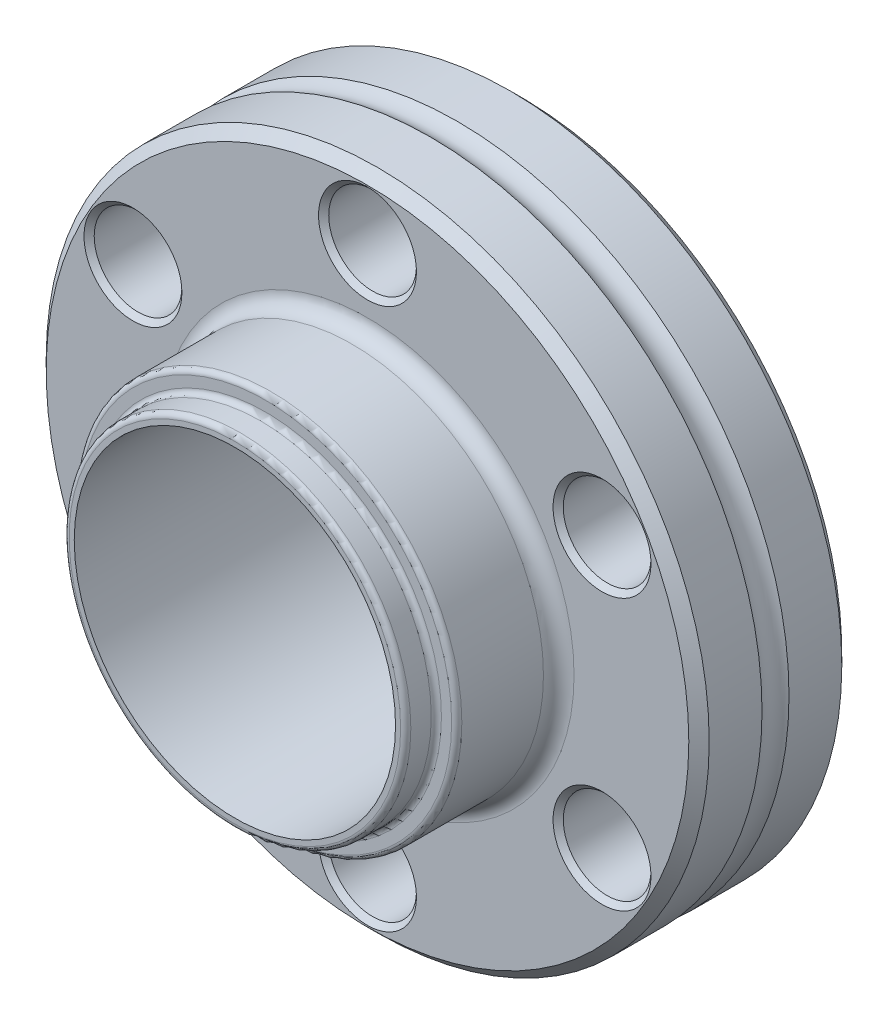
ISO-10303-21;
HEADER;
FILE_DESCRIPTION(('STEP AP214'),'2;1');
FILE_NAME('part.step','',(''),(''),'','','');
FILE_SCHEMA(('AUTOMOTIVE_DESIGN { 1 0 10303 214 1 1 1 1 }'));
ENDSEC;
DATA;
#1=APPLICATION_CONTEXT('core data for automotive mechanical design processes');
#2=APPLICATION_PROTOCOL_DEFINITION('international standard','automotive_design',2000,#1);
#3=PRODUCT_CONTEXT('',#1,'mechanical');
#4=PRODUCT('Part','Part','',(#3));
#5=PRODUCT_RELATED_PRODUCT_CATEGORY('part','',(#4));
#6=PRODUCT_DEFINITION_FORMATION('','',#4);
#7=PRODUCT_DEFINITION_CONTEXT('part definition',#1,'design');
#8=PRODUCT_DEFINITION('design','',#6,#7);
#9=PRODUCT_DEFINITION_SHAPE('','',#8);
#10=(LENGTH_UNIT() NAMED_UNIT(*) SI_UNIT(.MILLI.,.METRE.));
#11=(NAMED_UNIT(*) PLANE_ANGLE_UNIT() SI_UNIT($,.RADIAN.));
#12=(NAMED_UNIT(*) SI_UNIT($,.STERADIAN.) SOLID_ANGLE_UNIT());
#13=UNCERTAINTY_MEASURE_WITH_UNIT(LENGTH_MEASURE(1.E-05),#10,'distance_accuracy_value','');
#14=(GEOMETRIC_REPRESENTATION_CONTEXT(3) GLOBAL_UNCERTAINTY_ASSIGNED_CONTEXT((#13)) GLOBAL_UNIT_ASSIGNED_CONTEXT((#10,
#11,#12)) REPRESENTATION_CONTEXT('',''));
#15=CARTESIAN_POINT('',(0.,0.,0.));
#16=DIRECTION('',(0.,0.,1.));
#17=DIRECTION('',(1.,0.,0.));
#18=AXIS2_PLACEMENT_3D('',#15,#16,#17);
#19=CARTESIAN_POINT('',(0.,0.,-6.45160000000001));
#20=DIRECTION('',(0.,0.,-1.));
#21=DIRECTION('',(-1.,0.,0.));
#22=AXIS2_PLACEMENT_3D('',#19,#20,#21);
#23=CONICAL_SURFACE('',#22,9.271,0.349065850398823);
#24=CARTESIAN_POINT('',(0.,0.,-5.94360000000001));
#25=DIRECTION('',(0.,0.,1.));
#26=DIRECTION('',(1.,0.,0.));
#27=AXIS2_PLACEMENT_3D('',#24,#25,#26);
#28=CIRCLE('',#27,9.0861031209928);
#29=CARTESIAN_POINT('',(9.0861031209928,0.,-5.94360000000001));
#30=VERTEX_POINT('',#29);
#31=EDGE_CURVE('E169',#30,#30,#28,.T.);
#32=ORIENTED_EDGE('',*,*,#31,.T.);
#33=EDGE_LOOP('',(#32));
#34=FACE_BOUND('',#33,.T.);
#35=CARTESIAN_POINT('',(0.,0.,-6.45160000000001));
#36=DIRECTION('',(0.,0.,1.));
#37=DIRECTION('',(1.,0.,0.));
#38=AXIS2_PLACEMENT_3D('',#35,#36,#37);
#39=CIRCLE('',#38,9.271);
#40=CARTESIAN_POINT('',(9.271,0.,-6.45160000000001));
#41=VERTEX_POINT('',#40);
#42=EDGE_CURVE('E154',#41,#41,#39,.T.);
#43=ORIENTED_EDGE('',*,*,#42,.F.);
#44=EDGE_LOOP('',(#43));
#45=FACE_BOUND('',#44,.T.);
#46=ADVANCED_FACE('F32',(#34,#45),#23,.F.);
#47=CARTESIAN_POINT('',(0.,0.,-5.92002147285428));
#48=DIRECTION('',(0.,0.,1.));
#49=DIRECTION('',(1.,0.,0.));
#50=AXIS2_PLACEMENT_3D('',#47,#48,#49);
#51=CONICAL_SURFACE('',#50,10.7315,1.22173047639607);
#52=ORIENTED_EDGE('',*,*,#42,.T.);
#53=EDGE_LOOP('',(#52));
#54=FACE_BOUND('',#53,.T.);
#55=CARTESIAN_POINT('',(0.,0.,-5.92002147285428));
#56=DIRECTION('',(0.,0.,1.));
#57=DIRECTION('',(1.,0.,0.));
#58=AXIS2_PLACEMENT_3D('',#55,#56,#57);
#59=CIRCLE('',#58,10.7315);
#60=CARTESIAN_POINT('',(10.7315,0.,-5.92002147285428));
#61=VERTEX_POINT('',#60);
#62=EDGE_CURVE('E157',#61,#61,#59,.T.);
#63=ORIENTED_EDGE('',*,*,#62,.F.);
#64=EDGE_LOOP('',(#63));
#65=FACE_BOUND('',#64,.T.);
#66=ADVANCED_FACE('F194',(#54,#65),#51,.T.);
#67=CARTESIAN_POINT('',(0.,0.,-7.112));
#68=DIRECTION('',(0.,0.,1.));
#69=DIRECTION('',(1.,0.,0.));
#70=AXIS2_PLACEMENT_3D('',#67,#68,#69);
#71=CYLINDRICAL_SURFACE('',#70,10.7315);
#72=ORIENTED_EDGE('',*,*,#62,.T.);
#73=EDGE_LOOP('',(#72));
#74=FACE_BOUND('',#73,.T.);
#75=CARTESIAN_POINT('',(0.,0.,-7.112));
#76=DIRECTION('',(0.,0.,1.));
#77=DIRECTION('',(1.,0.,0.));
#78=AXIS2_PLACEMENT_3D('',#75,#76,#77);
#79=CIRCLE('',#78,10.7315);
#80=CARTESIAN_POINT('',(10.7315,0.,-7.112));
#81=VERTEX_POINT('',#80);
#82=EDGE_CURVE('E160',#81,#81,#79,.T.);
#83=ORIENTED_EDGE('',*,*,#82,.F.);
#84=EDGE_LOOP('',(#83));
#85=FACE_BOUND('',#84,.T.);
#86=ADVANCED_FACE('F200',(#74,#85),#71,.F.);
#87=CARTESIAN_POINT('',(16.51,0.,-7.112));
#88=DIRECTION('',(0.,0.,-1.));
#89=DIRECTION('',(-1.,0.,0.));
#90=AXIS2_PLACEMENT_3D('',#87,#88,#89);
#91=PLANE('',#90);
#92=CARTESIAN_POINT('',(0.,0.,-7.112));
#93=DIRECTION('',(0.,0.,-1.));
#94=DIRECTION('',(-1.,0.,0.));
#95=AXIS2_PLACEMENT_3D('',#92,#93,#94);
#96=CIRCLE('',#95,16.002);
#97=CARTESIAN_POINT('',(-16.002,0.,-7.112));
#98=VERTEX_POINT('',#97);
#99=EDGE_CURVE('E76',#98,#98,#96,.T.);
#100=ORIENTED_EDGE('',*,*,#99,.T.);
#101=EDGE_LOOP('',(#100));
#102=FACE_BOUND('',#101,.T.);
#103=CARTESIAN_POINT('',(11.6804310310022,-6.7437,-7.112));
#104=DIRECTION('',(0.,0.,-1.));
#105=DIRECTION('',(-1.,0.,0.));
#106=AXIS2_PLACEMENT_3D('',#103,#104,#105);
#107=CIRCLE('',#106,2.43839999995556);
#108=CARTESIAN_POINT('',(9.24203103104664,-6.7437,-7.112));
#109=VERTEX_POINT('',#108);
#110=EDGE_CURVE('E136',#109,#109,#107,.F.);
#111=ORIENTED_EDGE('',*,*,#110,.T.);
#112=EDGE_LOOP('',(#111));
#113=FACE_BOUND('',#112,.T.);
#114=CARTESIAN_POINT('',(0.,-13.4874,-7.112));
#115=DIRECTION('',(0.,0.,-1.));
#116=DIRECTION('',(-1.,0.,0.));
#117=AXIS2_PLACEMENT_3D('',#114,#115,#116);
#118=CIRCLE('',#117,2.43839999995556);
#119=CARTESIAN_POINT('',(-2.43839999995555,-13.4874,-7.112));
#120=VERTEX_POINT('',#119);
#121=EDGE_CURVE('E139',#120,#120,#118,.F.);
#122=ORIENTED_EDGE('',*,*,#121,.T.);
#123=EDGE_LOOP('',(#122));
#124=FACE_BOUND('',#123,.T.);
#125=CARTESIAN_POINT('',(11.6804310310022,6.74369999999999,-7.112));
#126=DIRECTION('',(0.,0.,-1.));
#127=DIRECTION('',(-1.,0.,0.));
#128=AXIS2_PLACEMENT_3D('',#125,#126,#127);
#129=CIRCLE('',#128,2.43839999995556);
#130=CARTESIAN_POINT('',(9.24203103104664,6.74369999999999,-7.112));
#131=VERTEX_POINT('',#130);
#132=EDGE_CURVE('E142',#131,#131,#129,.F.);
#133=ORIENTED_EDGE('',*,*,#132,.T.);
#134=EDGE_LOOP('',(#133));
#135=FACE_BOUND('',#134,.T.);
#136=CARTESIAN_POINT('',(-11.6804310310022,-6.7437,-7.112));
#137=DIRECTION('',(0.,0.,-1.));
#138=DIRECTION('',(-1.,0.,0.));
#139=AXIS2_PLACEMENT_3D('',#136,#137,#138);
#140=CIRCLE('',#139,2.43839999995556);
#141=CARTESIAN_POINT('',(-14.1188310309578,-6.7437,-7.112));
#142=VERTEX_POINT('',#141);
#143=EDGE_CURVE('E145',#142,#142,#140,.F.);
#144=ORIENTED_EDGE('',*,*,#143,.T.);
#145=EDGE_LOOP('',(#144));
#146=FACE_BOUND('',#145,.T.);
#147=CARTESIAN_POINT('',(0.,13.4874,-7.112));
#148=DIRECTION('',(0.,0.,-1.));
#149=DIRECTION('',(-1.,0.,0.));
#150=AXIS2_PLACEMENT_3D('',#147,#148,#149);
#151=CIRCLE('',#150,2.43839999995556);
#152=CARTESIAN_POINT('',(-2.43839999995556,13.4874,-7.112));
#153=VERTEX_POINT('',#152);
#154=EDGE_CURVE('E148',#153,#153,#151,.F.);
#155=ORIENTED_EDGE('',*,*,#154,.T.);
#156=EDGE_LOOP('',(#155));
#157=FACE_BOUND('',#156,.T.);
#158=CARTESIAN_POINT('',(-11.6804310310022,6.7437,-7.112));
#159=DIRECTION('',(0.,0.,-1.));
#160=DIRECTION('',(-1.,0.,0.));
#161=AXIS2_PLACEMENT_3D('',#158,#159,#160);
#162=CIRCLE('',#161,2.43839999995556);
#163=CARTESIAN_POINT('',(-14.1188310309578,6.7437,-7.112));
#164=VERTEX_POINT('',#163);
#165=EDGE_CURVE('E151',#164,#164,#162,.F.);
#166=ORIENTED_EDGE('',*,*,#165,.T.);
#167=EDGE_LOOP('',(#166));
#168=FACE_BOUND('',#167,.T.);
#169=ORIENTED_EDGE('',*,*,#82,.T.);
#170=EDGE_LOOP('',(#169));
#171=FACE_BOUND('',#170,.T.);
#172=ADVANCED_FACE('F311',(#102,#113,#124,#135,#146,#157,#168,#171),#91,.T.);
#173=CARTESIAN_POINT('',(0.,0.,-7.112));
#174=DIRECTION('',(0.,0.,1.));
#175=DIRECTION('',(1.,0.,0.));
#176=AXIS2_PLACEMENT_3D('',#173,#174,#175);
#177=CYLINDRICAL_SURFACE('',#176,16.51);
#178=CARTESIAN_POINT('',(0.,0.,-6.60399999999999));
#179=DIRECTION('',(0.,0.,-1.));
#180=DIRECTION('',(-1.,0.,0.));
#181=AXIS2_PLACEMENT_3D('',#178,#179,#180);
#182=CIRCLE('',#181,16.51);
#183=CARTESIAN_POINT('',(-16.51,0.,-6.60399999999999));
#184=VERTEX_POINT('',#183);
#185=EDGE_CURVE('E79',#184,#184,#182,.F.);
#186=ORIENTED_EDGE('',*,*,#185,.T.);
#187=EDGE_LOOP('',(#186));
#188=FACE_BOUND('',#187,.T.);
#189=CARTESIAN_POINT('',(0.,0.,-3.97402083301042));
#190=DIRECTION('',(0.,0.,1.));
#191=DIRECTION('',(1.,0.,0.));
#192=AXIS2_PLACEMENT_3D('',#189,#190,#191);
#193=CIRCLE('',#192,16.51);
#194=CARTESIAN_POINT('',(16.51,0.,-3.97402083301042));
#195=VERTEX_POINT('',#194);
#196=EDGE_CURVE('E163',#195,#195,#193,.T.);
#197=ORIENTED_EDGE('',*,*,#196,.F.);
#198=EDGE_LOOP('',(#197));
#199=FACE_BOUND('',#198,.T.);
#200=ADVANCED_FACE('F307',(#188,#199),#177,.T.);
#201=CARTESIAN_POINT('',(0.,0.,-3.302));
#202=DIRECTION('',(0.,0.,1.));
#203=DIRECTION('',(1.,0.,0.));
#204=AXIS2_PLACEMENT_3D('',#201,#202,#203);
#205=TOROIDAL_SURFACE('',#204,17.272,1.016);
#206=ORIENTED_EDGE('',*,*,#196,.T.);
#207=EDGE_LOOP('',(#206));
#208=FACE_BOUND('',#207,.T.);
#209=CARTESIAN_POINT('',(0.,0.,-2.62997916698959));
#210=DIRECTION('',(0.,0.,1.));
#211=DIRECTION('',(1.,0.,0.));
#212=AXIS2_PLACEMENT_3D('',#209,#210,#211);
#213=CIRCLE('',#212,16.51);
#214=CARTESIAN_POINT('',(16.51,0.,-2.62997916698959));
#215=VERTEX_POINT('',#214);
#216=EDGE_CURVE('E166',#215,#215,#213,.T.);
#217=ORIENTED_EDGE('',*,*,#216,.F.);
#218=EDGE_LOOP('',(#217));
#219=FACE_BOUND('',#218,.T.);
#220=ADVANCED_FACE('F303',(#208,#219),#205,.F.);
#221=CARTESIAN_POINT('',(0.,0.,-7.112));
#222=DIRECTION('',(0.,0.,1.));
#223=DIRECTION('',(1.,0.,0.));
#224=AXIS2_PLACEMENT_3D('',#221,#222,#223);
#225=CYLINDRICAL_SURFACE('',#224,16.51);
#226=CARTESIAN_POINT('',(0.,0.,0.));
#227=DIRECTION('',(0.,0.,1.));
#228=DIRECTION('',(1.,0.,0.));
#229=AXIS2_PLACEMENT_3D('',#226,#227,#228);
#230=CIRCLE('',#229,16.51);
#231=CARTESIAN_POINT('',(16.51,0.,0.));
#232=VERTEX_POINT('',#231);
#233=EDGE_CURVE('E70',#232,#232,#230,.F.);
#234=ORIENTED_EDGE('',*,*,#233,.T.);
#235=EDGE_LOOP('',(#234));
#236=FACE_BOUND('',#235,.T.);
#237=ORIENTED_EDGE('',*,*,#216,.T.);
#238=EDGE_LOOP('',(#237));
#239=FACE_BOUND('',#238,.T.);
#240=ADVANCED_FACE('F297',(#236,#239),#225,.T.);
#241=CARTESIAN_POINT('',(0.,0.,0.507999999999999));
#242=DIRECTION('',(0.,0.,1.));
#243=DIRECTION('',(1.,0.,0.));
#244=AXIS2_PLACEMENT_3D('',#241,#242,#243);
#245=PLANE('',#244);
#246=CARTESIAN_POINT('',(0.,0.,0.507999999999999));
#247=DIRECTION('',(0.,0.,1.));
#248=DIRECTION('',(1.,0.,0.));
#249=AXIS2_PLACEMENT_3D('',#246,#247,#248);
#250=CIRCLE('',#249,10.287);
#251=CARTESIAN_POINT('',(10.287,0.,0.507999999999999));
#252=VERTEX_POINT('',#251);
#253=EDGE_CURVE('E10',#252,#252,#250,.F.);
#254=ORIENTED_EDGE('',*,*,#253,.T.);
#255=EDGE_LOOP('',(#254));
#256=FACE_BOUND('',#255,.T.);
#257=CARTESIAN_POINT('',(0.,0.,0.507999999999999));
#258=DIRECTION('',(0.,0.,1.));
#259=DIRECTION('',(1.,0.,0.));
#260=AXIS2_PLACEMENT_3D('',#257,#258,#259);
#261=CIRCLE('',#260,16.002);
#262=CARTESIAN_POINT('',(16.002,0.,0.507999999999999));
#263=VERTEX_POINT('',#262);
#264=EDGE_CURVE('E73',#263,#263,#261,.T.);
#265=ORIENTED_EDGE('',*,*,#264,.T.);
#266=EDGE_LOOP('',(#265));
#267=FACE_BOUND('',#266,.T.);
#268=CARTESIAN_POINT('',(0.,-13.4874,0.507999999999999));
#269=DIRECTION('',(0.,0.,1.));
#270=DIRECTION('',(1.,0.,0.));
#271=AXIS2_PLACEMENT_3D('',#268,#269,#270);
#272=CIRCLE('',#271,2.43839999995556);
#273=CARTESIAN_POINT('',(2.43839999995556,-13.4874,0.507999999999999));
#274=VERTEX_POINT('',#273);
#275=EDGE_CURVE('E106',#274,#274,#272,.F.);
#276=ORIENTED_EDGE('',*,*,#275,.T.);
#277=EDGE_LOOP('',(#276));
#278=FACE_BOUND('',#277,.T.);
#279=CARTESIAN_POINT('',(-11.6804310310022,6.7437,0.507999999999999));
#280=DIRECTION('',(0.,0.,1.));
#281=DIRECTION('',(1.,0.,0.));
#282=AXIS2_PLACEMENT_3D('',#279,#280,#281);
#283=CIRCLE('',#282,2.43839999995556);
#284=CARTESIAN_POINT('',(-9.24203103104664,6.7437,0.507999999999999));
#285=VERTEX_POINT('',#284);
#286=EDGE_CURVE('E109',#285,#285,#283,.F.);
#287=ORIENTED_EDGE('',*,*,#286,.T.);
#288=EDGE_LOOP('',(#287));
#289=FACE_BOUND('',#288,.T.);
#290=CARTESIAN_POINT('',(11.6804310310022,6.74369999999999,0.507999999999999));
#291=DIRECTION('',(0.,0.,1.));
#292=DIRECTION('',(1.,0.,0.));
#293=AXIS2_PLACEMENT_3D('',#290,#291,#292);
#294=CIRCLE('',#293,2.43839999995556);
#295=CARTESIAN_POINT('',(14.1188310309578,6.74369999999999,0.507999999999999));
#296=VERTEX_POINT('',#295);
#297=EDGE_CURVE('E112',#296,#296,#294,.F.);
#298=ORIENTED_EDGE('',*,*,#297,.T.);
#299=EDGE_LOOP('',(#298));
#300=FACE_BOUND('',#299,.T.);
#301=CARTESIAN_POINT('',(0.,13.4874,0.507999999999999));
#302=DIRECTION('',(0.,0.,1.));
#303=DIRECTION('',(1.,0.,0.));
#304=AXIS2_PLACEMENT_3D('',#301,#302,#303);
#305=CIRCLE('',#304,2.43839999995556);
#306=CARTESIAN_POINT('',(2.43839999995556,13.4874,0.507999999999999));
#307=VERTEX_POINT('',#306);
#308=EDGE_CURVE('E115',#307,#307,#305,.F.);
#309=ORIENTED_EDGE('',*,*,#308,.T.);
#310=EDGE_LOOP('',(#309));
#311=FACE_BOUND('',#310,.T.);
#312=CARTESIAN_POINT('',(-11.6804310310022,-6.7437,0.507999999999999));
#313=DIRECTION('',(0.,0.,1.));
#314=DIRECTION('',(1.,0.,0.));
#315=AXIS2_PLACEMENT_3D('',#312,#313,#314);
#316=CIRCLE('',#315,2.43839999995556);
#317=CARTESIAN_POINT('',(-9.24203103104664,-6.7437,0.507999999999999));
#318=VERTEX_POINT('',#317);
#319=EDGE_CURVE('E118',#318,#318,#316,.F.);
#320=ORIENTED_EDGE('',*,*,#319,.T.);
#321=EDGE_LOOP('',(#320));
#322=FACE_BOUND('',#321,.T.);
#323=CARTESIAN_POINT('',(11.6804310310022,-6.7437,0.507999999999999));
#324=DIRECTION('',(0.,0.,1.));
#325=DIRECTION('',(1.,0.,0.));
#326=AXIS2_PLACEMENT_3D('',#323,#324,#325);
#327=CIRCLE('',#326,2.43839999995556);
#328=CARTESIAN_POINT('',(14.1188310309578,-6.7437,0.507999999999999));
#329=VERTEX_POINT('',#328);
#330=EDGE_CURVE('E121',#329,#329,#327,.F.);
#331=ORIENTED_EDGE('',*,*,#330,.T.);
#332=EDGE_LOOP('',(#331));
#333=FACE_BOUND('',#332,.T.);
#334=ADVANCED_FACE('F289',(#256,#267,#278,#289,#300,#311,#322,#333),#245,.T.);
#335=CARTESIAN_POINT('',(9.0861031209928,0.,-5.94360000000001));
#336=DIRECTION('',(0.,0.,-1.));
#337=DIRECTION('',(-1.,0.,0.));
#338=AXIS2_PLACEMENT_3D('',#335,#336,#337);
#339=PLANE('',#338);
#340=CARTESIAN_POINT('',(0.,0.,-5.94360000000001));
#341=DIRECTION('',(0.,0.,-1.));
#342=DIRECTION('',(-1.,0.,0.));
#343=AXIS2_PLACEMENT_3D('',#340,#341,#342);
#344=CIRCLE('',#343,8.25500000000001);
#345=CARTESIAN_POINT('',(-8.25500000000001,0.,-5.94360000000001));
#346=VERTEX_POINT('',#345);
#347=EDGE_CURVE('E43',#346,#346,#344,.F.);
#348=ORIENTED_EDGE('',*,*,#347,.T.);
#349=EDGE_LOOP('',(#348));
#350=FACE_BOUND('',#349,.T.);
#351=ORIENTED_EDGE('',*,*,#31,.F.);
#352=EDGE_LOOP('',(#351));
#353=FACE_BOUND('',#352,.T.);
#354=ADVANCED_FACE('F285',(#350,#353),#339,.T.);
#355=CARTESIAN_POINT('',(0.,0.,5.58800000000001));
#356=DIRECTION('',(0.,0.,-1.));
#357=DIRECTION('',(-1.,0.,0.));
#358=AXIS2_PLACEMENT_3D('',#355,#356,#357);
#359=CYLINDRICAL_SURFACE('',#358,9.52499999999999);
#360=CARTESIAN_POINT('',(0.,0.,1.27));
#361=DIRECTION('',(0.,0.,1.));
#362=DIRECTION('',(1.,0.,0.));
#363=AXIS2_PLACEMENT_3D('',#360,#361,#362);
#364=CIRCLE('',#363,9.52499999999999);
#365=CARTESIAN_POINT('',(9.52499999999999,0.,1.27));
#366=VERTEX_POINT('',#365);
#367=EDGE_CURVE('E39',#366,#366,#364,.T.);
#368=ORIENTED_EDGE('',*,*,#367,.T.);
#369=EDGE_LOOP('',(#368));
#370=FACE_BOUND('',#369,.T.);
#371=CARTESIAN_POINT('',(0.,0.,5.33400000000001));
#372=DIRECTION('',(0.,0.,1.));
#373=DIRECTION('',(1.,0.,0.));
#374=AXIS2_PLACEMENT_3D('',#371,#372,#373);
#375=CIRCLE('',#374,9.52499999999999);
#376=CARTESIAN_POINT('',(9.52499999999999,0.,5.33400000000001));
#377=VERTEX_POINT('',#376);
#378=EDGE_CURVE('E61',#377,#377,#375,.F.);
#379=ORIENTED_EDGE('',*,*,#378,.T.);
#380=EDGE_LOOP('',(#379));
#381=FACE_BOUND('',#380,.T.);
#382=ADVANCED_FACE('F288',(#370,#381),#359,.T.);
#383=CARTESIAN_POINT('',(0.,0.,5.58800000000001));
#384=DIRECTION('',(0.,0.,1.));
#385=DIRECTION('',(1.,0.,0.));
#386=AXIS2_PLACEMENT_3D('',#383,#384,#385);
#387=PLANE('',#386);
#388=CARTESIAN_POINT('',(0.,0.,5.58800000000001));
#389=DIRECTION('',(0.,0.,1.));
#390=DIRECTION('',(1.,0.,0.));
#391=AXIS2_PLACEMENT_3D('',#388,#389,#390);
#392=CIRCLE('',#391,9.27099999999999);
#393=CARTESIAN_POINT('',(9.27099999999999,0.,5.58800000000001));
#394=VERTEX_POINT('',#393);
#395=EDGE_CURVE('E64',#394,#394,#392,.T.);
#396=ORIENTED_EDGE('',*,*,#395,.T.);
#397=EDGE_LOOP('',(#396));
#398=FACE_BOUND('',#397,.T.);
#399=CARTESIAN_POINT('',(0.,0.,5.58800000000001));
#400=DIRECTION('',(0.,0.,1.));
#401=DIRECTION('',(1.,0.,0.));
#402=AXIS2_PLACEMENT_3D('',#399,#400,#401);
#403=CIRCLE('',#402,8.76299999999999);
#404=CARTESIAN_POINT('',(8.76299999999999,0.,5.58800000000001));
#405=VERTEX_POINT('',#404);
#406=EDGE_CURVE('E67',#405,#405,#403,.F.);
#407=ORIENTED_EDGE('',*,*,#406,.T.);
#408=EDGE_LOOP('',(#407));
#409=FACE_BOUND('',#408,.T.);
#410=ADVANCED_FACE('F190',(#398,#409),#387,.T.);
#411=CARTESIAN_POINT('',(0.,0.,7.112));
#412=DIRECTION('',(0.,0.,-1.));
#413=DIRECTION('',(-1.,0.,0.));
#414=AXIS2_PLACEMENT_3D('',#411,#412,#413);
#415=CYLINDRICAL_SURFACE('',#414,8.50899999999999);
#416=CARTESIAN_POINT('',(0.,0.,5.84200000000001));
#417=DIRECTION('',(0.,0.,1.));
#418=DIRECTION('',(1.,0.,0.));
#419=AXIS2_PLACEMENT_3D('',#416,#417,#418);
#420=CIRCLE('',#419,8.50899999999999);
#421=CARTESIAN_POINT('',(8.50899999999999,0.,5.84200000000001));
#422=VERTEX_POINT('',#421);
#423=EDGE_CURVE('E55',#422,#422,#420,.T.);
#424=ORIENTED_EDGE('',*,*,#423,.T.);
#425=EDGE_LOOP('',(#424));
#426=FACE_BOUND('',#425,.T.);
#427=CARTESIAN_POINT('',(0.,0.,6.858));
#428=DIRECTION('',(0.,0.,1.));
#429=DIRECTION('',(1.,0.,0.));
#430=AXIS2_PLACEMENT_3D('',#427,#428,#429);
#431=CIRCLE('',#430,8.50899999999999);
#432=CARTESIAN_POINT('',(8.50899999999999,0.,6.858));
#433=VERTEX_POINT('',#432);
#434=EDGE_CURVE('E58',#433,#433,#431,.F.);
#435=ORIENTED_EDGE('',*,*,#434,.T.);
#436=EDGE_LOOP('',(#435));
#437=FACE_BOUND('',#436,.T.);
#438=ADVANCED_FACE('F180',(#426,#437),#415,.T.);
#439=CARTESIAN_POINT('',(0.,0.,7.112));
#440=DIRECTION('',(0.,0.,1.));
#441=DIRECTION('',(1.,0.,0.));
#442=AXIS2_PLACEMENT_3D('',#439,#440,#441);
#443=PLANE('',#442);
#444=CARTESIAN_POINT('',(0.,0.,7.112));
#445=DIRECTION('',(0.,0.,1.));
#446=DIRECTION('',(1.,0.,0.));
#447=AXIS2_PLACEMENT_3D('',#444,#445,#446);
#448=CIRCLE('',#447,8.25499999999999);
#449=CARTESIAN_POINT('',(8.25499999999999,0.,7.112));
#450=VERTEX_POINT('',#449);
#451=EDGE_CURVE('E52',#450,#450,#448,.T.);
#452=ORIENTED_EDGE('',*,*,#451,.T.);
#453=EDGE_LOOP('',(#452));
#454=FACE_BOUND('',#453,.T.);
#455=CARTESIAN_POINT('',(0.,0.,7.112));
#456=DIRECTION('',(0.,0.,1.));
#457=DIRECTION('',(1.,0.,0.));
#458=AXIS2_PLACEMENT_3D('',#455,#456,#457);
#459=CIRCLE('',#458,8.00100000000001);
#460=CARTESIAN_POINT('',(8.00100000000001,0.,7.112));
#461=VERTEX_POINT('',#460);
#462=EDGE_CURVE('E172',#461,#461,#459,.T.);
#463=ORIENTED_EDGE('',*,*,#462,.F.);
#464=EDGE_LOOP('',(#463));
#465=FACE_BOUND('',#464,.T.);
#466=ADVANCED_FACE('F178',(#454,#465),#443,.T.);
#467=CARTESIAN_POINT('',(0.,0.,7.112));
#468=DIRECTION('',(0.,0.,1.));
#469=DIRECTION('',(1.,0.,0.));
#470=AXIS2_PLACEMENT_3D('',#467,#468,#469);
#471=CYLINDRICAL_SURFACE('',#470,8.00100000000001);
#472=CARTESIAN_POINT('',(0.,0.,-5.68960000000001));
#473=DIRECTION('',(0.,0.,-1.));
#474=DIRECTION('',(-1.,0.,0.));
#475=AXIS2_PLACEMENT_3D('',#472,#473,#474);
#476=CIRCLE('',#475,8.00100000000001);
#477=CARTESIAN_POINT('',(-8.00100000000001,0.,-5.68960000000001));
#478=VERTEX_POINT('',#477);
#479=EDGE_CURVE('E47',#478,#478,#476,.T.);
#480=ORIENTED_EDGE('',*,*,#479,.T.);
#481=EDGE_LOOP('',(#480));
#482=FACE_BOUND('',#481,.T.);
#483=ORIENTED_EDGE('',*,*,#462,.T.);
#484=EDGE_LOOP('',(#483));
#485=FACE_BOUND('',#484,.T.);
#486=ADVANCED_FACE('F176',(#482,#485),#471,.F.);
#487=CARTESIAN_POINT('',(11.6804310310022,-6.7437,0.507999999999999));
#488=DIRECTION('',(0.,0.,1.));
#489=DIRECTION('',(1.,0.,0.));
#490=AXIS2_PLACEMENT_3D('',#487,#488,#489);
#491=CYLINDRICAL_SURFACE('',#490,2.18439999999999);
#492=CARTESIAN_POINT('',(11.6804310310022,-6.7437,-6.85800000004443));
#493=DIRECTION('',(0.,0.,-1.));
#494=DIRECTION('',(-1.,0.,0.));
#495=AXIS2_PLACEMENT_3D('',#492,#493,#494);
#496=CIRCLE('',#495,2.18439999999999);
#497=CARTESIAN_POINT('',(9.49603103100221,-6.7437,-6.85800000004443));
#498=VERTEX_POINT('',#497);
#499=EDGE_CURVE('E130',#498,#498,#496,.T.);
#500=ORIENTED_EDGE('',*,*,#499,.T.);
#501=EDGE_LOOP('',(#500));
#502=FACE_BOUND('',#501,.T.);
#503=CARTESIAN_POINT('',(11.6804310310022,-6.7437,0.254000000044436));
#504=DIRECTION('',(0.,0.,1.));
#505=DIRECTION('',(1.,0.,0.));
#506=AXIS2_PLACEMENT_3D('',#503,#504,#505);
#507=CIRCLE('',#506,2.18439999999999);
#508=CARTESIAN_POINT('',(13.8648310310022,-6.7437,0.254000000044436));
#509=VERTEX_POINT('',#508);
#510=EDGE_CURVE('E133',#509,#509,#507,.T.);
#511=ORIENTED_EDGE('',*,*,#510,.T.);
#512=EDGE_LOOP('',(#511));
#513=FACE_BOUND('',#512,.T.);
#514=ADVANCED_FACE('F187',(#502,#513),#491,.F.);
#515=CARTESIAN_POINT('',(11.6804310310022,6.74369999999999,-7.112));
#516=DIRECTION('',(0.,0.,-1.));
#517=DIRECTION('',(-1.,0.,0.));
#518=AXIS2_PLACEMENT_3D('',#515,#516,#517);
#519=CYLINDRICAL_SURFACE('',#518,2.18439999999999);
#520=CARTESIAN_POINT('',(11.6804310310022,6.74369999999999,0.254000000044428));
#521=DIRECTION('',(0.,0.,1.));
#522=DIRECTION('',(1.,0.,0.));
#523=AXIS2_PLACEMENT_3D('',#520,#521,#522);
#524=CIRCLE('',#523,2.18439999999999);
#525=CARTESIAN_POINT('',(13.8648310310022,6.74369999999999,0.254000000044428));
#526=VERTEX_POINT('',#525);
#527=EDGE_CURVE('E94',#526,#526,#524,.T.);
#528=ORIENTED_EDGE('',*,*,#527,.T.);
#529=EDGE_LOOP('',(#528));
#530=FACE_BOUND('',#529,.T.);
#531=CARTESIAN_POINT('',(11.6804310310022,6.74369999999999,-6.85800000004444));
#532=DIRECTION('',(0.,0.,-1.));
#533=DIRECTION('',(-1.,0.,0.));
#534=AXIS2_PLACEMENT_3D('',#531,#532,#533);
#535=CIRCLE('',#534,2.18439999999999);
#536=CARTESIAN_POINT('',(9.49603103100221,6.74369999999999,-6.85800000004444));
#537=VERTEX_POINT('',#536);
#538=EDGE_CURVE('E97',#537,#537,#535,.T.);
#539=ORIENTED_EDGE('',*,*,#538,.T.);
#540=EDGE_LOOP('',(#539));
#541=FACE_BOUND('',#540,.T.);
#542=ADVANCED_FACE('F489',(#530,#541),#519,.F.);
#543=CARTESIAN_POINT('',(0.,-13.4874,-7.112));
#544=DIRECTION('',(0.,0.,-1.));
#545=DIRECTION('',(-1.,0.,0.));
#546=AXIS2_PLACEMENT_3D('',#543,#544,#545);
#547=CYLINDRICAL_SURFACE('',#546,2.18439999999999);
#548=CARTESIAN_POINT('',(0.,-13.4874,0.254000000044428));
#549=DIRECTION('',(0.,0.,1.));
#550=DIRECTION('',(1.,0.,0.));
#551=AXIS2_PLACEMENT_3D('',#548,#549,#550);
#552=CIRCLE('',#551,2.18439999999999);
#553=CARTESIAN_POINT('',(2.18439999999999,-13.4874,0.254000000044428));
#554=VERTEX_POINT('',#553);
#555=EDGE_CURVE('E124',#554,#554,#552,.T.);
#556=ORIENTED_EDGE('',*,*,#555,.T.);
#557=EDGE_LOOP('',(#556));
#558=FACE_BOUND('',#557,.T.);
#559=CARTESIAN_POINT('',(0.,-13.4874,-6.85800000004444));
#560=DIRECTION('',(0.,0.,-1.));
#561=DIRECTION('',(-1.,0.,0.));
#562=AXIS2_PLACEMENT_3D('',#559,#560,#561);
#563=CIRCLE('',#562,2.18439999999999);
#564=CARTESIAN_POINT('',(-2.18439999999998,-13.4874,-6.85800000004444));
#565=VERTEX_POINT('',#564);
#566=EDGE_CURVE('E127',#565,#565,#563,.T.);
#567=ORIENTED_EDGE('',*,*,#566,.T.);
#568=EDGE_LOOP('',(#567));
#569=FACE_BOUND('',#568,.T.);
#570=ADVANCED_FACE('F480',(#558,#569),#547,.F.);
#571=CARTESIAN_POINT('',(-11.6804310310022,-6.7437,-7.112));
#572=DIRECTION('',(0.,0.,-1.));
#573=DIRECTION('',(-1.,0.,0.));
#574=AXIS2_PLACEMENT_3D('',#571,#572,#573);
#575=CYLINDRICAL_SURFACE('',#574,2.18439999999999);
#576=CARTESIAN_POINT('',(-11.6804310310022,-6.7437,0.254000000044428));
#577=DIRECTION('',(0.,0.,1.));
#578=DIRECTION('',(1.,0.,0.));
#579=AXIS2_PLACEMENT_3D('',#576,#577,#578);
#580=CIRCLE('',#579,2.18439999999999);
#581=CARTESIAN_POINT('',(-9.49603103100221,-6.7437,0.254000000044428));
#582=VERTEX_POINT('',#581);
#583=EDGE_CURVE('E82',#582,#582,#580,.T.);
#584=ORIENTED_EDGE('',*,*,#583,.T.);
#585=EDGE_LOOP('',(#584));
#586=FACE_BOUND('',#585,.T.);
#587=CARTESIAN_POINT('',(-11.6804310310022,-6.7437,-6.85800000004444));
#588=DIRECTION('',(0.,0.,-1.));
#589=DIRECTION('',(-1.,0.,0.));
#590=AXIS2_PLACEMENT_3D('',#587,#588,#589);
#591=CIRCLE('',#590,2.18439999999999);
#592=CARTESIAN_POINT('',(-13.8648310310022,-6.7437,-6.85800000004444));
#593=VERTEX_POINT('',#592);
#594=EDGE_CURVE('E85',#593,#593,#591,.T.);
#595=ORIENTED_EDGE('',*,*,#594,.T.);
#596=EDGE_LOOP('',(#595));
#597=FACE_BOUND('',#596,.T.);
#598=ADVANCED_FACE('F471',(#586,#597),#575,.F.);
#599=CARTESIAN_POINT('',(-11.6804310310022,6.7437,-7.112));
#600=DIRECTION('',(0.,0.,-1.));
#601=DIRECTION('',(-1.,0.,0.));
#602=AXIS2_PLACEMENT_3D('',#599,#600,#601);
#603=CYLINDRICAL_SURFACE('',#602,2.18439999999999);
#604=CARTESIAN_POINT('',(-11.6804310310022,6.7437,0.254000000044428));
#605=DIRECTION('',(0.,0.,1.));
#606=DIRECTION('',(1.,0.,0.));
#607=AXIS2_PLACEMENT_3D('',#604,#605,#606);
#608=CIRCLE('',#607,2.18439999999999);
#609=CARTESIAN_POINT('',(-9.49603103100221,6.7437,0.254000000044428));
#610=VERTEX_POINT('',#609);
#611=EDGE_CURVE('E100',#610,#610,#608,.T.);
#612=ORIENTED_EDGE('',*,*,#611,.T.);
#613=EDGE_LOOP('',(#612));
#614=FACE_BOUND('',#613,.T.);
#615=CARTESIAN_POINT('',(-11.6804310310022,6.7437,-6.85800000004444));
#616=DIRECTION('',(0.,0.,-1.));
#617=DIRECTION('',(-1.,0.,0.));
#618=AXIS2_PLACEMENT_3D('',#615,#616,#617);
#619=CIRCLE('',#618,2.18439999999999);
#620=CARTESIAN_POINT('',(-13.8648310310022,6.7437,-6.85800000004444));
#621=VERTEX_POINT('',#620);
#622=EDGE_CURVE('E103',#621,#621,#619,.T.);
#623=ORIENTED_EDGE('',*,*,#622,.T.);
#624=EDGE_LOOP('',(#623));
#625=FACE_BOUND('',#624,.T.);
#626=ADVANCED_FACE('F462',(#614,#625),#603,.F.);
#627=CARTESIAN_POINT('',(0.,13.4874,-7.112));
#628=DIRECTION('',(0.,0.,-1.));
#629=DIRECTION('',(-1.,0.,0.));
#630=AXIS2_PLACEMENT_3D('',#627,#628,#629);
#631=CYLINDRICAL_SURFACE('',#630,2.18439999999999);
#632=CARTESIAN_POINT('',(0.,13.4874,0.254000000044428));
#633=DIRECTION('',(0.,0.,1.));
#634=DIRECTION('',(1.,0.,0.));
#635=AXIS2_PLACEMENT_3D('',#632,#633,#634);
#636=CIRCLE('',#635,2.18439999999999);
#637=CARTESIAN_POINT('',(2.18439999999999,13.4874,0.254000000044428));
#638=VERTEX_POINT('',#637);
#639=EDGE_CURVE('E88',#638,#638,#636,.T.);
#640=ORIENTED_EDGE('',*,*,#639,.T.);
#641=EDGE_LOOP('',(#640));
#642=FACE_BOUND('',#641,.T.);
#643=CARTESIAN_POINT('',(0.,13.4874,-6.85800000004444));
#644=DIRECTION('',(0.,0.,-1.));
#645=DIRECTION('',(-1.,0.,0.));
#646=AXIS2_PLACEMENT_3D('',#643,#644,#645);
#647=CIRCLE('',#646,2.18439999999999);
#648=CARTESIAN_POINT('',(-2.18439999999999,13.4874,-6.85800000004444));
#649=VERTEX_POINT('',#648);
#650=EDGE_CURVE('E91',#649,#649,#647,.T.);
#651=ORIENTED_EDGE('',*,*,#650,.T.);
#652=EDGE_LOOP('',(#651));
#653=FACE_BOUND('',#652,.T.);
#654=ADVANCED_FACE('F210',(#642,#653),#631,.F.);
#655=CARTESIAN_POINT('',(11.6804310310022,-6.7437,-7.112));
#656=DIRECTION('',(0.,0.,-1.));
#657=DIRECTION('',(-1.,0.,0.));
#658=AXIS2_PLACEMENT_3D('',#655,#656,#657);
#659=CONICAL_SURFACE('',#658,2.43839999995556,0.785398163397438);
#660=ORIENTED_EDGE('',*,*,#499,.F.);
#661=EDGE_LOOP('',(#660));
#662=FACE_BOUND('',#661,.T.);
#663=ORIENTED_EDGE('',*,*,#110,.F.);
#664=EDGE_LOOP('',(#663));
#665=FACE_BOUND('',#664,.T.);
#666=ADVANCED_FACE('F206',(#662,#665),#659,.F.);
#667=CARTESIAN_POINT('',(0.,-13.4874,0.254000000044428));
#668=DIRECTION('',(0.,0.,1.));
#669=DIRECTION('',(1.,0.,0.));
#670=AXIS2_PLACEMENT_3D('',#667,#668,#669);
#671=CONICAL_SURFACE('',#670,2.18439999999999,0.785398163397447);
#672=ORIENTED_EDGE('',*,*,#275,.F.);
#673=EDGE_LOOP('',(#672));
#674=FACE_BOUND('',#673,.T.);
#675=ORIENTED_EDGE('',*,*,#555,.F.);
#676=EDGE_LOOP('',(#675));
#677=FACE_BOUND('',#676,.T.);
#678=ADVANCED_FACE('F209',(#674,#677),#671,.F.);
#679=CARTESIAN_POINT('',(-11.6804310310022,6.7437,0.254000000044428));
#680=DIRECTION('',(0.,0.,1.));
#681=DIRECTION('',(1.,0.,0.));
#682=AXIS2_PLACEMENT_3D('',#679,#680,#681);
#683=CONICAL_SURFACE('',#682,2.18439999999999,0.78539816339745);
#684=ORIENTED_EDGE('',*,*,#286,.F.);
#685=EDGE_LOOP('',(#684));
#686=FACE_BOUND('',#685,.T.);
#687=ORIENTED_EDGE('',*,*,#611,.F.);
#688=EDGE_LOOP('',(#687));
#689=FACE_BOUND('',#688,.T.);
#690=ADVANCED_FACE('F214',(#686,#689),#683,.F.);
#691=CARTESIAN_POINT('',(11.6804310310022,6.74369999999999,0.254000000044428));
#692=DIRECTION('',(0.,0.,1.));
#693=DIRECTION('',(1.,0.,0.));
#694=AXIS2_PLACEMENT_3D('',#691,#692,#693);
#695=CONICAL_SURFACE('',#694,2.18439999999999,0.78539816339745);
#696=ORIENTED_EDGE('',*,*,#297,.F.);
#697=EDGE_LOOP('',(#696));
#698=FACE_BOUND('',#697,.T.);
#699=ORIENTED_EDGE('',*,*,#527,.F.);
#700=EDGE_LOOP('',(#699));
#701=FACE_BOUND('',#700,.T.);
#702=ADVANCED_FACE('F218',(#698,#701),#695,.F.);
#703=CARTESIAN_POINT('',(0.,-13.4874,-6.85800000004444));
#704=DIRECTION('',(0.,0.,-1.));
#705=DIRECTION('',(-1.,0.,0.));
#706=AXIS2_PLACEMENT_3D('',#703,#704,#705);
#707=CONICAL_SURFACE('',#706,2.18439999999999,0.78539816339746);
#708=ORIENTED_EDGE('',*,*,#121,.F.);
#709=EDGE_LOOP('',(#708));
#710=FACE_BOUND('',#709,.T.);
#711=ORIENTED_EDGE('',*,*,#566,.F.);
#712=EDGE_LOOP('',(#711));
#713=FACE_BOUND('',#712,.T.);
#714=ADVANCED_FACE('F222',(#710,#713),#707,.F.);
#715=CARTESIAN_POINT('',(11.6804310310022,6.74369999999999,-6.85800000004444));
#716=DIRECTION('',(0.,0.,-1.));
#717=DIRECTION('',(-1.,0.,0.));
#718=AXIS2_PLACEMENT_3D('',#715,#716,#717);
#719=CONICAL_SURFACE('',#718,2.18439999999999,0.785398163397464);
#720=ORIENTED_EDGE('',*,*,#132,.F.);
#721=EDGE_LOOP('',(#720));
#722=FACE_BOUND('',#721,.T.);
#723=ORIENTED_EDGE('',*,*,#538,.F.);
#724=EDGE_LOOP('',(#723));
#725=FACE_BOUND('',#724,.T.);
#726=ADVANCED_FACE('F226',(#722,#725),#719,.F.);
#727=CARTESIAN_POINT('',(0.,13.4874,0.254000000044428));
#728=DIRECTION('',(0.,0.,1.));
#729=DIRECTION('',(1.,0.,0.));
#730=AXIS2_PLACEMENT_3D('',#727,#728,#729);
#731=CONICAL_SURFACE('',#730,2.18439999999999,0.785398163397447);
#732=ORIENTED_EDGE('',*,*,#308,.F.);
#733=EDGE_LOOP('',(#732));
#734=FACE_BOUND('',#733,.T.);
#735=ORIENTED_EDGE('',*,*,#639,.F.);
#736=EDGE_LOOP('',(#735));
#737=FACE_BOUND('',#736,.T.);
#738=ADVANCED_FACE('F230',(#734,#737),#731,.F.);
#739=CARTESIAN_POINT('',(-11.6804310310022,-6.7437,0.254000000044428));
#740=DIRECTION('',(0.,0.,1.));
#741=DIRECTION('',(1.,0.,0.));
#742=AXIS2_PLACEMENT_3D('',#739,#740,#741);
#743=CONICAL_SURFACE('',#742,2.18439999999999,0.78539816339745);
#744=ORIENTED_EDGE('',*,*,#319,.F.);
#745=EDGE_LOOP('',(#744));
#746=FACE_BOUND('',#745,.T.);
#747=ORIENTED_EDGE('',*,*,#583,.F.);
#748=EDGE_LOOP('',(#747));
#749=FACE_BOUND('',#748,.T.);
#750=ADVANCED_FACE('F234',(#746,#749),#743,.F.);
#751=CARTESIAN_POINT('',(11.6804310310022,-6.7437,0.254000000044436));
#752=DIRECTION('',(0.,0.,1.));
#753=DIRECTION('',(1.,0.,0.));
#754=AXIS2_PLACEMENT_3D('',#751,#752,#753);
#755=CONICAL_SURFACE('',#754,2.18439999999999,0.78539816339746);
#756=ORIENTED_EDGE('',*,*,#330,.F.);
#757=EDGE_LOOP('',(#756));
#758=FACE_BOUND('',#757,.T.);
#759=ORIENTED_EDGE('',*,*,#510,.F.);
#760=EDGE_LOOP('',(#759));
#761=FACE_BOUND('',#760,.T.);
#762=ADVANCED_FACE('F238',(#758,#761),#755,.F.);
#763=CARTESIAN_POINT('',(-11.6804310310022,-6.7437,-6.85800000004444));
#764=DIRECTION('',(0.,0.,-1.));
#765=DIRECTION('',(-1.,0.,0.));
#766=AXIS2_PLACEMENT_3D('',#763,#764,#765);
#767=CONICAL_SURFACE('',#766,2.18439999999999,0.785398163397464);
#768=ORIENTED_EDGE('',*,*,#143,.F.);
#769=EDGE_LOOP('',(#768));
#770=FACE_BOUND('',#769,.T.);
#771=ORIENTED_EDGE('',*,*,#594,.F.);
#772=EDGE_LOOP('',(#771));
#773=FACE_BOUND('',#772,.T.);
#774=ADVANCED_FACE('F242',(#770,#773),#767,.F.);
#775=CARTESIAN_POINT('',(0.,13.4874,-6.85800000004444));
#776=DIRECTION('',(0.,0.,-1.));
#777=DIRECTION('',(-1.,0.,0.));
#778=AXIS2_PLACEMENT_3D('',#775,#776,#777);
#779=CONICAL_SURFACE('',#778,2.18439999999999,0.78539816339746);
#780=ORIENTED_EDGE('',*,*,#154,.F.);
#781=EDGE_LOOP('',(#780));
#782=FACE_BOUND('',#781,.T.);
#783=ORIENTED_EDGE('',*,*,#650,.F.);
#784=EDGE_LOOP('',(#783));
#785=FACE_BOUND('',#784,.T.);
#786=ADVANCED_FACE('F246',(#782,#785),#779,.F.);
#787=CARTESIAN_POINT('',(-11.6804310310022,6.7437,-6.85800000004444));
#788=DIRECTION('',(0.,0.,-1.));
#789=DIRECTION('',(-1.,0.,0.));
#790=AXIS2_PLACEMENT_3D('',#787,#788,#789);
#791=CONICAL_SURFACE('',#790,2.18439999999999,0.785398163397464);
#792=ORIENTED_EDGE('',*,*,#165,.F.);
#793=EDGE_LOOP('',(#792));
#794=FACE_BOUND('',#793,.T.);
#795=ORIENTED_EDGE('',*,*,#622,.F.);
#796=EDGE_LOOP('',(#795));
#797=FACE_BOUND('',#796,.T.);
#798=ADVANCED_FACE('F250',(#794,#797),#791,.F.);
#799=CARTESIAN_POINT('',(0.,0.,-6.60399999999999));
#800=DIRECTION('',(0.,0.,1.));
#801=DIRECTION('',(1.,0.,0.));
#802=AXIS2_PLACEMENT_3D('',#799,#800,#801);
#803=CONICAL_SURFACE('',#802,16.51,0.785398163397455);
#804=ORIENTED_EDGE('',*,*,#99,.F.);
#805=EDGE_LOOP('',(#804));
#806=FACE_BOUND('',#805,.T.);
#807=ORIENTED_EDGE('',*,*,#185,.F.);
#808=EDGE_LOOP('',(#807));
#809=FACE_BOUND('',#808,.T.);
#810=ADVANCED_FACE('F254',(#806,#809),#803,.T.);
#811=CARTESIAN_POINT('',(0.,0.,0.507999999999999));
#812=DIRECTION('',(0.,0.,-1.));
#813=DIRECTION('',(-1.,0.,0.));
#814=AXIS2_PLACEMENT_3D('',#811,#812,#813);
#815=CONICAL_SURFACE('',#814,16.002,0.785398163397445);
#816=ORIENTED_EDGE('',*,*,#233,.F.);
#817=EDGE_LOOP('',(#816));
#818=FACE_BOUND('',#817,.T.);
#819=ORIENTED_EDGE('',*,*,#264,.F.);
#820=EDGE_LOOP('',(#819));
#821=FACE_BOUND('',#820,.T.);
#822=ADVANCED_FACE('F258',(#818,#821),#815,.T.);
#823=CARTESIAN_POINT('',(0.,0.,5.33400000000001));
#824=DIRECTION('',(0.,0.,1.));
#825=DIRECTION('',(1.,0.,0.));
#826=AXIS2_PLACEMENT_3D('',#823,#824,#825);
#827=TOROIDAL_SURFACE('',#826,9.27099999999999,0.254);
#828=ORIENTED_EDGE('',*,*,#378,.F.);
#829=EDGE_LOOP('',(#828));
#830=FACE_BOUND('',#829,.T.);
#831=ORIENTED_EDGE('',*,*,#395,.F.);
#832=EDGE_LOOP('',(#831));
#833=FACE_BOUND('',#832,.T.);
#834=ADVANCED_FACE('F262',(#830,#833),#827,.T.);
#835=CARTESIAN_POINT('',(0.,0.,5.84200000000001));
#836=DIRECTION('',(0.,0.,1.));
#837=DIRECTION('',(1.,0.,0.));
#838=AXIS2_PLACEMENT_3D('',#835,#836,#837);
#839=TOROIDAL_SURFACE('',#838,8.76299999999999,0.254);
#840=ORIENTED_EDGE('',*,*,#406,.F.);
#841=EDGE_LOOP('',(#840));
#842=FACE_BOUND('',#841,.T.);
#843=ORIENTED_EDGE('',*,*,#423,.F.);
#844=EDGE_LOOP('',(#843));
#845=FACE_BOUND('',#844,.T.);
#846=ADVANCED_FACE('F266',(#842,#845),#839,.F.);
#847=CARTESIAN_POINT('',(0.,0.,6.858));
#848=DIRECTION('',(0.,0.,1.));
#849=DIRECTION('',(1.,0.,0.));
#850=AXIS2_PLACEMENT_3D('',#847,#848,#849);
#851=TOROIDAL_SURFACE('',#850,8.25499999999999,0.254);
#852=ORIENTED_EDGE('',*,*,#434,.F.);
#853=EDGE_LOOP('',(#852));
#854=FACE_BOUND('',#853,.T.);
#855=ORIENTED_EDGE('',*,*,#451,.F.);
#856=EDGE_LOOP('',(#855));
#857=FACE_BOUND('',#856,.T.);
#858=ADVANCED_FACE('F270',(#854,#857),#851,.T.);
#859=CARTESIAN_POINT('',(0.,0.,-5.68960000000001));
#860=DIRECTION('',(0.,0.,-1.));
#861=DIRECTION('',(-1.,0.,0.));
#862=AXIS2_PLACEMENT_3D('',#859,#860,#861);
#863=TOROIDAL_SURFACE('',#862,8.25500000000001,0.254);
#864=ORIENTED_EDGE('',*,*,#347,.F.);
#865=EDGE_LOOP('',(#864));
#866=FACE_BOUND('',#865,.T.);
#867=ORIENTED_EDGE('',*,*,#479,.F.);
#868=EDGE_LOOP('',(#867));
#869=FACE_BOUND('',#868,.T.);
#870=ADVANCED_FACE('F273',(#866,#869),#863,.T.);
#871=CARTESIAN_POINT('',(0.,0.,1.27));
#872=DIRECTION('',(0.,0.,1.));
#873=DIRECTION('',(1.,0.,0.));
#874=AXIS2_PLACEMENT_3D('',#871,#872,#873);
#875=TOROIDAL_SURFACE('',#874,10.287,0.762);
#876=ORIENTED_EDGE('',*,*,#253,.F.);
#877=EDGE_LOOP('',(#876));
#878=FACE_BOUND('',#877,.T.);
#879=ORIENTED_EDGE('',*,*,#367,.F.);
#880=EDGE_LOOP('',(#879));
#881=FACE_BOUND('',#880,.T.);
#882=ADVANCED_FACE('F34',(#878,#881),#875,.F.);
#883=CLOSED_SHELL('',(#46,#66,#86,#172,#200,#220,#240,#334,#354,#382,#410,#438,#466,#486,#514,
#542,#570,#598,#626,#654,#666,#678,#690,#702,#714,#726,#738,#750,#762,#774,#786,#798,#810,#822,
#834,#846,#858,#870,#882));
#884=MANIFOLD_SOLID_BREP('B2',#883);
#885=ADVANCED_BREP_SHAPE_REPRESENTATION('',(#18,#884),#14);
#886=SHAPE_DEFINITION_REPRESENTATION(#9,#885);
ENDSEC;
END-ISO-10303-21;
